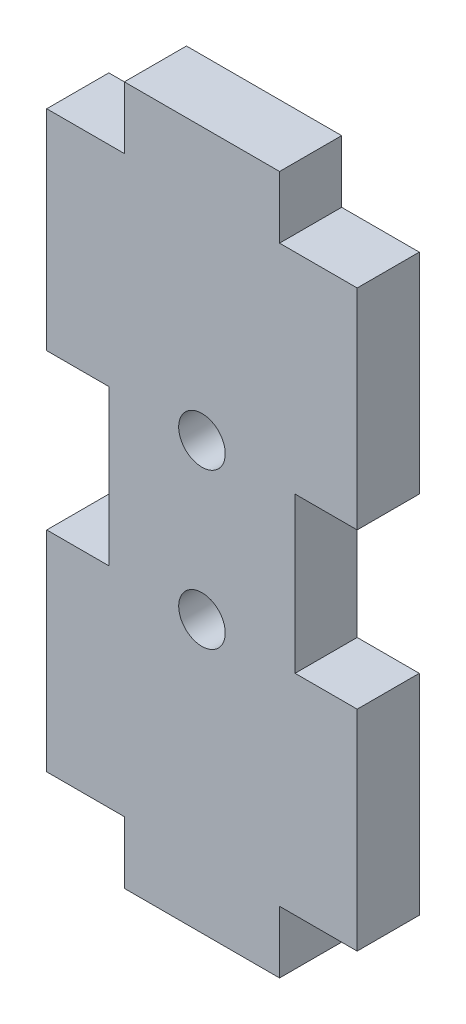
ISO-10303-21;
HEADER;
FILE_DESCRIPTION(('STEP AP214'),'2;1');
FILE_NAME('part.step','',(''),(''),'','','');
FILE_SCHEMA(('AUTOMOTIVE_DESIGN { 1 0 10303 214 1 1 1 1 }'));
ENDSEC;
DATA;
#1=APPLICATION_CONTEXT('core data for automotive mechanical design processes');
#2=APPLICATION_PROTOCOL_DEFINITION('international standard','automotive_design',2000,#1);
#3=PRODUCT_CONTEXT('',#1,'mechanical');
#4=PRODUCT('Part','Part','',(#3));
#5=PRODUCT_RELATED_PRODUCT_CATEGORY('part','',(#4));
#6=PRODUCT_DEFINITION_FORMATION('','',#4);
#7=PRODUCT_DEFINITION_CONTEXT('part definition',#1,'design');
#8=PRODUCT_DEFINITION('design','',#6,#7);
#9=PRODUCT_DEFINITION_SHAPE('','',#8);
#10=(LENGTH_UNIT() NAMED_UNIT(*) SI_UNIT(.MILLI.,.METRE.));
#11=(NAMED_UNIT(*) PLANE_ANGLE_UNIT() SI_UNIT($,.RADIAN.));
#12=(NAMED_UNIT(*) SI_UNIT($,.STERADIAN.) SOLID_ANGLE_UNIT());
#13=UNCERTAINTY_MEASURE_WITH_UNIT(LENGTH_MEASURE(1.E-05),#10,'distance_accuracy_value','');
#14=(GEOMETRIC_REPRESENTATION_CONTEXT(3) GLOBAL_UNCERTAINTY_ASSIGNED_CONTEXT((#13)) GLOBAL_UNIT_ASSIGNED_CONTEXT((#10,
#11,#12)) REPRESENTATION_CONTEXT('',''));
#15=CARTESIAN_POINT('',(0.,0.,0.));
#16=DIRECTION('',(0.,0.,1.));
#17=DIRECTION('',(1.,0.,0.));
#18=AXIS2_PLACEMENT_3D('',#15,#16,#17);
#19=CARTESIAN_POINT('',(0.,0.,4.));
#20=DIRECTION('',(0.,0.,-1.));
#21=DIRECTION('',(-1.,0.,0.));
#22=AXIS2_PLACEMENT_3D('',#19,#20,#21);
#23=PLANE('',#22);
#24=DIRECTION('',(0.,-1.,0.));
#25=VECTOR('',#24,1.);
#26=CARTESIAN_POINT('',(0.,0.,4.));
#27=LINE('',#26,#25);
#28=CARTESIAN_POINT('',(0.,13.5,4.));
#29=VERTEX_POINT('',#28);
#30=CARTESIAN_POINT('',(0.,0.,4.));
#31=VERTEX_POINT('',#30);
#32=EDGE_CURVE('E272',#29,#31,#27,.T.);
#33=ORIENTED_EDGE('',*,*,#32,.T.);
#34=DIRECTION('',(1.,0.,0.));
#35=VECTOR('',#34,1.);
#36=CARTESIAN_POINT('',(0.,0.,4.));
#37=LINE('',#36,#35);
#38=CARTESIAN_POINT('',(5.,0.,4.));
#39=VERTEX_POINT('',#38);
#40=EDGE_CURVE('E136',#31,#39,#37,.T.);
#41=ORIENTED_EDGE('',*,*,#40,.T.);
#42=DIRECTION('',(0.,-1.,0.));
#43=VECTOR('',#42,1.);
#44=CARTESIAN_POINT('',(5.,0.,4.));
#45=LINE('',#44,#43);
#46=CARTESIAN_POINT('',(5.,-4.00000000000001,4.));
#47=VERTEX_POINT('',#46);
#48=EDGE_CURVE('E341',#39,#47,#45,.T.);
#49=ORIENTED_EDGE('',*,*,#48,.T.);
#50=DIRECTION('',(1.,0.,0.));
#51=VECTOR('',#50,1.);
#52=CARTESIAN_POINT('',(5.,-4.00000000000001,4.));
#53=LINE('',#52,#51);
#54=CARTESIAN_POINT('',(15.,-4.00000000000001,4.));
#55=VERTEX_POINT('',#54);
#56=EDGE_CURVE('E361',#47,#55,#53,.T.);
#57=ORIENTED_EDGE('',*,*,#56,.T.);
#58=DIRECTION('',(0.,1.,0.));
#59=VECTOR('',#58,1.);
#60=CARTESIAN_POINT('',(15.,0.,4.));
#61=LINE('',#60,#59);
#62=CARTESIAN_POINT('',(15.,0.,4.));
#63=VERTEX_POINT('',#62);
#64=EDGE_CURVE('E357',#55,#63,#61,.T.);
#65=ORIENTED_EDGE('',*,*,#64,.T.);
#66=DIRECTION('',(1.,0.,0.));
#67=VECTOR('',#66,1.);
#68=CARTESIAN_POINT('',(15.,0.,4.));
#69=LINE('',#68,#67);
#70=CARTESIAN_POINT('',(20.,0.,4.));
#71=VERTEX_POINT('',#70);
#72=EDGE_CURVE('E360',#63,#71,#69,.T.);
#73=ORIENTED_EDGE('',*,*,#72,.T.);
#74=DIRECTION('',(0.,1.,0.));
#75=VECTOR('',#74,1.);
#76=CARTESIAN_POINT('',(20.,0.,4.));
#77=LINE('',#76,#75);
#78=CARTESIAN_POINT('',(20.,13.5,4.));
#79=VERTEX_POINT('',#78);
#80=EDGE_CURVE('E365',#71,#79,#77,.T.);
#81=ORIENTED_EDGE('',*,*,#80,.T.);
#82=DIRECTION('',(-1.,0.,0.));
#83=VECTOR('',#82,1.);
#84=CARTESIAN_POINT('',(20.,13.5,4.));
#85=LINE('',#84,#83);
#86=CARTESIAN_POINT('',(16.,13.5,4.));
#87=VERTEX_POINT('',#86);
#88=EDGE_CURVE('E372',#79,#87,#85,.T.);
#89=ORIENTED_EDGE('',*,*,#88,.T.);
#90=DIRECTION('',(0.,1.,0.));
#91=VECTOR('',#90,1.);
#92=CARTESIAN_POINT('',(16.,23.5,4.));
#93=LINE('',#92,#91);
#94=CARTESIAN_POINT('',(16.,23.5,4.));
#95=VERTEX_POINT('',#94);
#96=EDGE_CURVE('E375',#87,#95,#93,.T.);
#97=ORIENTED_EDGE('',*,*,#96,.T.);
#98=DIRECTION('',(1.,0.,0.));
#99=VECTOR('',#98,1.);
#100=CARTESIAN_POINT('',(20.,23.5,4.));
#101=LINE('',#100,#99);
#102=CARTESIAN_POINT('',(20.,23.5,4.));
#103=VERTEX_POINT('',#102);
#104=EDGE_CURVE('E378',#95,#103,#101,.T.);
#105=ORIENTED_EDGE('',*,*,#104,.T.);
#106=DIRECTION('',(0.,1.,0.));
#107=VECTOR('',#106,1.);
#108=CARTESIAN_POINT('',(20.,23.5,4.));
#109=LINE('',#108,#107);
#110=CARTESIAN_POINT('',(20.,37.,4.));
#111=VERTEX_POINT('',#110);
#112=EDGE_CURVE('E381',#103,#111,#109,.T.);
#113=ORIENTED_EDGE('',*,*,#112,.T.);
#114=DIRECTION('',(-1.,0.,0.));
#115=VECTOR('',#114,1.);
#116=CARTESIAN_POINT('',(15.,37.,4.));
#117=LINE('',#116,#115);
#118=CARTESIAN_POINT('',(15.,37.,4.));
#119=VERTEX_POINT('',#118);
#120=EDGE_CURVE('E384',#111,#119,#117,.T.);
#121=ORIENTED_EDGE('',*,*,#120,.T.);
#122=DIRECTION('',(0.,1.,0.));
#123=VECTOR('',#122,1.);
#124=CARTESIAN_POINT('',(15.,37.,4.));
#125=LINE('',#124,#123);
#126=CARTESIAN_POINT('',(15.,41.,4.));
#127=VERTEX_POINT('',#126);
#128=EDGE_CURVE('E387',#119,#127,#125,.T.);
#129=ORIENTED_EDGE('',*,*,#128,.T.);
#130=DIRECTION('',(-1.,0.,0.));
#131=VECTOR('',#130,1.);
#132=CARTESIAN_POINT('',(5.,41.,4.));
#133=LINE('',#132,#131);
#134=CARTESIAN_POINT('',(5.,41.,4.));
#135=VERTEX_POINT('',#134);
#136=EDGE_CURVE('E390',#127,#135,#133,.T.);
#137=ORIENTED_EDGE('',*,*,#136,.T.);
#138=DIRECTION('',(0.,-1.,0.));
#139=VECTOR('',#138,1.);
#140=CARTESIAN_POINT('',(5.,37.,4.));
#141=LINE('',#140,#139);
#142=CARTESIAN_POINT('',(5.,37.,4.));
#143=VERTEX_POINT('',#142);
#144=EDGE_CURVE('E393',#135,#143,#141,.T.);
#145=ORIENTED_EDGE('',*,*,#144,.T.);
#146=DIRECTION('',(-1.,0.,0.));
#147=VECTOR('',#146,1.);
#148=CARTESIAN_POINT('',(0.,37.,4.));
#149=LINE('',#148,#147);
#150=CARTESIAN_POINT('',(0.,37.,4.));
#151=VERTEX_POINT('',#150);
#152=EDGE_CURVE('E396',#143,#151,#149,.T.);
#153=ORIENTED_EDGE('',*,*,#152,.T.);
#154=DIRECTION('',(0.,-1.,0.));
#155=VECTOR('',#154,1.);
#156=CARTESIAN_POINT('',(0.,23.5,4.));
#157=LINE('',#156,#155);
#158=CARTESIAN_POINT('',(0.,23.5,4.));
#159=VERTEX_POINT('',#158);
#160=EDGE_CURVE('E191',#151,#159,#157,.T.);
#161=ORIENTED_EDGE('',*,*,#160,.T.);
#162=DIRECTION('',(1.,0.,0.));
#163=VECTOR('',#162,1.);
#164=CARTESIAN_POINT('',(0.,23.5,4.));
#165=LINE('',#164,#163);
#166=CARTESIAN_POINT('',(4.,23.5,4.));
#167=VERTEX_POINT('',#166);
#168=EDGE_CURVE('E185',#159,#167,#165,.T.);
#169=ORIENTED_EDGE('',*,*,#168,.T.);
#170=DIRECTION('',(0.,-1.,0.));
#171=VECTOR('',#170,1.);
#172=CARTESIAN_POINT('',(4.,23.5,4.));
#173=LINE('',#172,#171);
#174=CARTESIAN_POINT('',(4.,13.5,4.));
#175=VERTEX_POINT('',#174);
#176=EDGE_CURVE('E189',#167,#175,#173,.T.);
#177=ORIENTED_EDGE('',*,*,#176,.T.);
#178=DIRECTION('',(-1.,0.,0.));
#179=VECTOR('',#178,1.);
#180=CARTESIAN_POINT('',(0.,13.5,4.));
#181=LINE('',#180,#179);
#182=EDGE_CURVE('E57',#175,#29,#181,.T.);
#183=ORIENTED_EDGE('',*,*,#182,.T.);
#184=EDGE_LOOP('',(#33,#41,#49,#57,#65,#73,#81,#89,#97,#105,#113,#121,#129,#137,#145,#153,#161,
#169,#177,#183));
#185=FACE_BOUND('',#184,.T.);
#186=CARTESIAN_POINT('',(10.,23.5,4.));
#187=DIRECTION('',(0.,0.,1.));
#188=DIRECTION('',(1.,0.,0.));
#189=AXIS2_PLACEMENT_3D('',#186,#187,#188);
#190=CIRCLE('',#189,1.5);
#191=CARTESIAN_POINT('',(11.5,23.5,4.));
#192=VERTEX_POINT('',#191);
#193=EDGE_CURVE('E218',#192,#192,#190,.T.);
#194=ORIENTED_EDGE('',*,*,#193,.F.);
#195=EDGE_LOOP('',(#194));
#196=FACE_BOUND('',#195,.T.);
#197=CARTESIAN_POINT('',(10.,13.5,4.));
#198=DIRECTION('',(0.,0.,1.));
#199=DIRECTION('',(-1.,0.,0.));
#200=AXIS2_PLACEMENT_3D('',#197,#198,#199);
#201=CIRCLE('',#200,1.5);
#202=CARTESIAN_POINT('',(8.5,13.5,4.));
#203=VERTEX_POINT('',#202);
#204=EDGE_CURVE('E439',#203,#203,#201,.T.);
#205=ORIENTED_EDGE('',*,*,#204,.F.);
#206=EDGE_LOOP('',(#205));
#207=FACE_BOUND('',#206,.T.);
#208=ADVANCED_FACE('F39',(#185,#196,#207),#23,.F.);
#209=CARTESIAN_POINT('',(0.,0.,0.));
#210=DIRECTION('',(0.,0.,-1.));
#211=DIRECTION('',(-1.,0.,0.));
#212=AXIS2_PLACEMENT_3D('',#209,#210,#211);
#213=PLANE('',#212);
#214=CARTESIAN_POINT('',(10.,23.5,0.));
#215=DIRECTION('',(0.,0.,1.));
#216=DIRECTION('',(1.,0.,0.));
#217=AXIS2_PLACEMENT_3D('',#214,#215,#216);
#218=CIRCLE('',#217,1.5);
#219=CARTESIAN_POINT('',(11.5,23.5,0.));
#220=VERTEX_POINT('',#219);
#221=EDGE_CURVE('E446',#220,#220,#218,.T.);
#222=ORIENTED_EDGE('',*,*,#221,.T.);
#223=EDGE_LOOP('',(#222));
#224=FACE_BOUND('',#223,.T.);
#225=DIRECTION('',(0.,-1.,0.));
#226=VECTOR('',#225,1.);
#227=CARTESIAN_POINT('',(0.,0.,0.));
#228=LINE('',#227,#226);
#229=CARTESIAN_POINT('',(0.,13.5,0.));
#230=VERTEX_POINT('',#229);
#231=CARTESIAN_POINT('',(0.,0.,0.));
#232=VERTEX_POINT('',#231);
#233=EDGE_CURVE('E213',#230,#232,#228,.T.);
#234=ORIENTED_EDGE('',*,*,#233,.F.);
#235=DIRECTION('',(-1.,0.,0.));
#236=VECTOR('',#235,1.);
#237=CARTESIAN_POINT('',(0.,13.5,0.));
#238=LINE('',#237,#236);
#239=CARTESIAN_POINT('',(4.,13.5,0.));
#240=VERTEX_POINT('',#239);
#241=EDGE_CURVE('E128',#240,#230,#238,.T.);
#242=ORIENTED_EDGE('',*,*,#241,.F.);
#243=DIRECTION('',(0.,-1.,0.));
#244=VECTOR('',#243,1.);
#245=CARTESIAN_POINT('',(4.,23.5,0.));
#246=LINE('',#245,#244);
#247=CARTESIAN_POINT('',(4.,23.5,0.));
#248=VERTEX_POINT('',#247);
#249=EDGE_CURVE('E122',#248,#240,#246,.T.);
#250=ORIENTED_EDGE('',*,*,#249,.F.);
#251=DIRECTION('',(1.,0.,0.));
#252=VECTOR('',#251,1.);
#253=CARTESIAN_POINT('',(0.,23.5,0.));
#254=LINE('',#253,#252);
#255=CARTESIAN_POINT('',(0.,23.5,0.));
#256=VERTEX_POINT('',#255);
#257=EDGE_CURVE('E200',#256,#248,#254,.T.);
#258=ORIENTED_EDGE('',*,*,#257,.F.);
#259=DIRECTION('',(0.,-1.,0.));
#260=VECTOR('',#259,1.);
#261=CARTESIAN_POINT('',(0.,23.5,0.));
#262=LINE('',#261,#260);
#263=CARTESIAN_POINT('',(0.,37.,0.));
#264=VERTEX_POINT('',#263);
#265=EDGE_CURVE('E263',#264,#256,#262,.T.);
#266=ORIENTED_EDGE('',*,*,#265,.F.);
#267=DIRECTION('',(-1.,0.,0.));
#268=VECTOR('',#267,1.);
#269=CARTESIAN_POINT('',(0.,37.,0.));
#270=LINE('',#269,#268);
#271=CARTESIAN_POINT('',(5.,37.,0.));
#272=VERTEX_POINT('',#271);
#273=EDGE_CURVE('E260',#272,#264,#270,.T.);
#274=ORIENTED_EDGE('',*,*,#273,.F.);
#275=DIRECTION('',(0.,-1.,0.));
#276=VECTOR('',#275,1.);
#277=CARTESIAN_POINT('',(5.,37.,0.));
#278=LINE('',#277,#276);
#279=CARTESIAN_POINT('',(5.,41.,0.));
#280=VERTEX_POINT('',#279);
#281=EDGE_CURVE('E257',#280,#272,#278,.T.);
#282=ORIENTED_EDGE('',*,*,#281,.F.);
#283=DIRECTION('',(-1.,0.,0.));
#284=VECTOR('',#283,1.);
#285=CARTESIAN_POINT('',(5.,41.,0.));
#286=LINE('',#285,#284);
#287=CARTESIAN_POINT('',(15.,41.,0.));
#288=VERTEX_POINT('',#287);
#289=EDGE_CURVE('E254',#288,#280,#286,.T.);
#290=ORIENTED_EDGE('',*,*,#289,.F.);
#291=DIRECTION('',(0.,1.,0.));
#292=VECTOR('',#291,1.);
#293=CARTESIAN_POINT('',(15.,37.,0.));
#294=LINE('',#293,#292);
#295=CARTESIAN_POINT('',(15.,37.,0.));
#296=VERTEX_POINT('',#295);
#297=EDGE_CURVE('E251',#296,#288,#294,.T.);
#298=ORIENTED_EDGE('',*,*,#297,.F.);
#299=DIRECTION('',(-1.,0.,0.));
#300=VECTOR('',#299,1.);
#301=CARTESIAN_POINT('',(15.,37.,0.));
#302=LINE('',#301,#300);
#303=CARTESIAN_POINT('',(20.,37.,0.));
#304=VERTEX_POINT('',#303);
#305=EDGE_CURVE('E248',#304,#296,#302,.T.);
#306=ORIENTED_EDGE('',*,*,#305,.F.);
#307=DIRECTION('',(0.,1.,0.));
#308=VECTOR('',#307,1.);
#309=CARTESIAN_POINT('',(20.,23.5,0.));
#310=LINE('',#309,#308);
#311=CARTESIAN_POINT('',(20.,23.5,0.));
#312=VERTEX_POINT('',#311);
#313=EDGE_CURVE('E245',#312,#304,#310,.T.);
#314=ORIENTED_EDGE('',*,*,#313,.F.);
#315=DIRECTION('',(1.,0.,0.));
#316=VECTOR('',#315,1.);
#317=CARTESIAN_POINT('',(20.,23.5,0.));
#318=LINE('',#317,#316);
#319=CARTESIAN_POINT('',(16.,23.5,0.));
#320=VERTEX_POINT('',#319);
#321=EDGE_CURVE('E242',#320,#312,#318,.T.);
#322=ORIENTED_EDGE('',*,*,#321,.F.);
#323=DIRECTION('',(0.,1.,0.));
#324=VECTOR('',#323,1.);
#325=CARTESIAN_POINT('',(16.,23.5,0.));
#326=LINE('',#325,#324);
#327=CARTESIAN_POINT('',(16.,13.5,0.));
#328=VERTEX_POINT('',#327);
#329=EDGE_CURVE('E239',#328,#320,#326,.T.);
#330=ORIENTED_EDGE('',*,*,#329,.F.);
#331=DIRECTION('',(-1.,0.,0.));
#332=VECTOR('',#331,1.);
#333=CARTESIAN_POINT('',(20.,13.5,0.));
#334=LINE('',#333,#332);
#335=CARTESIAN_POINT('',(20.,13.5,0.));
#336=VERTEX_POINT('',#335);
#337=EDGE_CURVE('E236',#336,#328,#334,.T.);
#338=ORIENTED_EDGE('',*,*,#337,.F.);
#339=DIRECTION('',(0.,1.,0.));
#340=VECTOR('',#339,1.);
#341=CARTESIAN_POINT('',(20.,0.,0.));
#342=LINE('',#341,#340);
#343=CARTESIAN_POINT('',(20.,0.,0.));
#344=VERTEX_POINT('',#343);
#345=EDGE_CURVE('E233',#344,#336,#342,.T.);
#346=ORIENTED_EDGE('',*,*,#345,.F.);
#347=DIRECTION('',(1.,0.,0.));
#348=VECTOR('',#347,1.);
#349=CARTESIAN_POINT('',(15.,0.,0.));
#350=LINE('',#349,#348);
#351=CARTESIAN_POINT('',(15.,0.,0.));
#352=VERTEX_POINT('',#351);
#353=EDGE_CURVE('E230',#352,#344,#350,.T.);
#354=ORIENTED_EDGE('',*,*,#353,.F.);
#355=DIRECTION('',(0.,1.,0.));
#356=VECTOR('',#355,1.);
#357=CARTESIAN_POINT('',(15.,0.,0.));
#358=LINE('',#357,#356);
#359=CARTESIAN_POINT('',(15.,-4.00000000000001,0.));
#360=VERTEX_POINT('',#359);
#361=EDGE_CURVE('E227',#360,#352,#358,.T.);
#362=ORIENTED_EDGE('',*,*,#361,.F.);
#363=DIRECTION('',(1.,0.,0.));
#364=VECTOR('',#363,1.);
#365=CARTESIAN_POINT('',(5.,-4.00000000000001,0.));
#366=LINE('',#365,#364);
#367=CARTESIAN_POINT('',(5.,-4.00000000000001,0.));
#368=VERTEX_POINT('',#367);
#369=EDGE_CURVE('E224',#368,#360,#366,.T.);
#370=ORIENTED_EDGE('',*,*,#369,.F.);
#371=DIRECTION('',(0.,-1.,0.));
#372=VECTOR('',#371,1.);
#373=CARTESIAN_POINT('',(5.,0.,0.));
#374=LINE('',#373,#372);
#375=CARTESIAN_POINT('',(5.,0.,0.));
#376=VERTEX_POINT('',#375);
#377=EDGE_CURVE('E221',#376,#368,#374,.T.);
#378=ORIENTED_EDGE('',*,*,#377,.F.);
#379=DIRECTION('',(1.,0.,0.));
#380=VECTOR('',#379,1.);
#381=CARTESIAN_POINT('',(0.,0.,0.));
#382=LINE('',#381,#380);
#383=EDGE_CURVE('E217',#232,#376,#382,.T.);
#384=ORIENTED_EDGE('',*,*,#383,.F.);
#385=EDGE_LOOP('',(#234,#242,#250,#258,#266,#274,#282,#290,#298,#306,#314,#322,#330,#338,#346,
#354,#362,#370,#378,#384));
#386=FACE_BOUND('',#385,.T.);
#387=CARTESIAN_POINT('',(10.,13.5,0.));
#388=DIRECTION('',(0.,0.,1.));
#389=DIRECTION('',(-1.,0.,0.));
#390=AXIS2_PLACEMENT_3D('',#387,#388,#389);
#391=CIRCLE('',#390,1.5);
#392=CARTESIAN_POINT('',(8.5,13.5,0.));
#393=VERTEX_POINT('',#392);
#394=EDGE_CURVE('E442',#393,#393,#391,.T.);
#395=ORIENTED_EDGE('',*,*,#394,.T.);
#396=EDGE_LOOP('',(#395));
#397=FACE_BOUND('',#396,.T.);
#398=ADVANCED_FACE('F345',(#224,#386,#397),#213,.T.);
#399=CARTESIAN_POINT('',(0.,0.,4.));
#400=DIRECTION('',(1.,0.,0.));
#401=DIRECTION('',(0.,0.,-1.));
#402=AXIS2_PLACEMENT_3D('',#399,#400,#401);
#403=PLANE('',#402);
#404=ORIENTED_EDGE('',*,*,#233,.T.);
#405=DIRECTION('',(0.,0.,-1.));
#406=VECTOR('',#405,1.);
#407=CARTESIAN_POINT('',(0.,0.,4.));
#408=LINE('',#407,#406);
#409=EDGE_CURVE('E11',#31,#232,#408,.T.);
#410=ORIENTED_EDGE('',*,*,#409,.F.);
#411=ORIENTED_EDGE('',*,*,#32,.F.);
#412=DIRECTION('',(0.,0.,-1.));
#413=VECTOR('',#412,1.);
#414=CARTESIAN_POINT('',(0.,13.5,4.));
#415=LINE('',#414,#413);
#416=EDGE_CURVE('E209',#29,#230,#415,.T.);
#417=ORIENTED_EDGE('',*,*,#416,.T.);
#418=EDGE_LOOP('',(#404,#410,#411,#417));
#419=FACE_BOUND('',#418,.T.);
#420=ADVANCED_FACE('F41',(#419),#403,.F.);
#421=CARTESIAN_POINT('',(0.,0.,4.));
#422=DIRECTION('',(0.,1.,0.));
#423=DIRECTION('',(-1.,0.,0.));
#424=AXIS2_PLACEMENT_3D('',#421,#422,#423);
#425=PLANE('',#424);
#426=ORIENTED_EDGE('',*,*,#383,.T.);
#427=DIRECTION('',(0.,0.,-1.));
#428=VECTOR('',#427,1.);
#429=CARTESIAN_POINT('',(5.,0.,4.));
#430=LINE('',#429,#428);
#431=EDGE_CURVE('E49',#39,#376,#430,.T.);
#432=ORIENTED_EDGE('',*,*,#431,.F.);
#433=ORIENTED_EDGE('',*,*,#40,.F.);
#434=ORIENTED_EDGE('',*,*,#409,.T.);
#435=EDGE_LOOP('',(#426,#432,#433,#434));
#436=FACE_BOUND('',#435,.T.);
#437=ADVANCED_FACE('F626',(#436),#425,.F.);
#438=CARTESIAN_POINT('',(5.,0.,4.));
#439=DIRECTION('',(1.,0.,0.));
#440=DIRECTION('',(0.,0.,-1.));
#441=AXIS2_PLACEMENT_3D('',#438,#439,#440);
#442=PLANE('',#441);
#443=ORIENTED_EDGE('',*,*,#377,.T.);
#444=DIRECTION('',(0.,0.,-1.));
#445=VECTOR('',#444,1.);
#446=CARTESIAN_POINT('',(5.,-4.00000000000001,4.));
#447=LINE('',#446,#445);
#448=EDGE_CURVE('E331',#47,#368,#447,.T.);
#449=ORIENTED_EDGE('',*,*,#448,.F.);
#450=ORIENTED_EDGE('',*,*,#48,.F.);
#451=ORIENTED_EDGE('',*,*,#431,.T.);
#452=EDGE_LOOP('',(#443,#449,#450,#451));
#453=FACE_BOUND('',#452,.T.);
#454=ADVANCED_FACE('F339',(#453),#442,.F.);
#455=CARTESIAN_POINT('',(5.,-4.00000000000001,4.));
#456=DIRECTION('',(0.,1.,0.));
#457=DIRECTION('',(0.,0.,1.));
#458=AXIS2_PLACEMENT_3D('',#455,#456,#457);
#459=PLANE('',#458);
#460=ORIENTED_EDGE('',*,*,#369,.T.);
#461=DIRECTION('',(0.,0.,-1.));
#462=VECTOR('',#461,1.);
#463=CARTESIAN_POINT('',(15.,-4.00000000000001,4.));
#464=LINE('',#463,#462);
#465=EDGE_CURVE('E327',#55,#360,#464,.T.);
#466=ORIENTED_EDGE('',*,*,#465,.F.);
#467=ORIENTED_EDGE('',*,*,#56,.F.);
#468=ORIENTED_EDGE('',*,*,#448,.T.);
#469=EDGE_LOOP('',(#460,#466,#467,#468));
#470=FACE_BOUND('',#469,.T.);
#471=ADVANCED_FACE('F351',(#470),#459,.F.);
#472=CARTESIAN_POINT('',(15.,0.,4.));
#473=DIRECTION('',(-1.,0.,0.));
#474=DIRECTION('',(0.,-1.,0.));
#475=AXIS2_PLACEMENT_3D('',#472,#473,#474);
#476=PLANE('',#475);
#477=ORIENTED_EDGE('',*,*,#361,.T.);
#478=DIRECTION('',(0.,0.,-1.));
#479=VECTOR('',#478,1.);
#480=CARTESIAN_POINT('',(15.,0.,4.));
#481=LINE('',#480,#479);
#482=EDGE_CURVE('E323',#63,#352,#481,.T.);
#483=ORIENTED_EDGE('',*,*,#482,.F.);
#484=ORIENTED_EDGE('',*,*,#64,.F.);
#485=ORIENTED_EDGE('',*,*,#465,.T.);
#486=EDGE_LOOP('',(#477,#483,#484,#485));
#487=FACE_BOUND('',#486,.T.);
#488=ADVANCED_FACE('F355',(#487),#476,.F.);
#489=CARTESIAN_POINT('',(15.,0.,4.));
#490=DIRECTION('',(0.,1.,0.));
#491=DIRECTION('',(-1.,0.,0.));
#492=AXIS2_PLACEMENT_3D('',#489,#490,#491);
#493=PLANE('',#492);
#494=ORIENTED_EDGE('',*,*,#353,.T.);
#495=DIRECTION('',(0.,0.,-1.));
#496=VECTOR('',#495,1.);
#497=CARTESIAN_POINT('',(20.,0.,4.));
#498=LINE('',#497,#496);
#499=EDGE_CURVE('E319',#71,#344,#498,.T.);
#500=ORIENTED_EDGE('',*,*,#499,.F.);
#501=ORIENTED_EDGE('',*,*,#72,.F.);
#502=ORIENTED_EDGE('',*,*,#482,.T.);
#503=EDGE_LOOP('',(#494,#500,#501,#502));
#504=FACE_BOUND('',#503,.T.);
#505=ADVANCED_FACE('F591',(#504),#493,.F.);
#506=CARTESIAN_POINT('',(20.,0.,4.));
#507=DIRECTION('',(-1.,0.,0.));
#508=DIRECTION('',(0.,-1.,0.));
#509=AXIS2_PLACEMENT_3D('',#506,#507,#508);
#510=PLANE('',#509);
#511=ORIENTED_EDGE('',*,*,#345,.T.);
#512=DIRECTION('',(0.,0.,-1.));
#513=VECTOR('',#512,1.);
#514=CARTESIAN_POINT('',(20.,13.5,4.));
#515=LINE('',#514,#513);
#516=EDGE_CURVE('E315',#79,#336,#515,.T.);
#517=ORIENTED_EDGE('',*,*,#516,.F.);
#518=ORIENTED_EDGE('',*,*,#80,.F.);
#519=ORIENTED_EDGE('',*,*,#499,.T.);
#520=EDGE_LOOP('',(#511,#517,#518,#519));
#521=FACE_BOUND('',#520,.T.);
#522=ADVANCED_FACE('F581',(#521),#510,.F.);
#523=CARTESIAN_POINT('',(20.,13.5,4.));
#524=DIRECTION('',(0.,-1.,0.));
#525=DIRECTION('',(0.,0.,-1.));
#526=AXIS2_PLACEMENT_3D('',#523,#524,#525);
#527=PLANE('',#526);
#528=ORIENTED_EDGE('',*,*,#337,.T.);
#529=DIRECTION('',(0.,0.,-1.));
#530=VECTOR('',#529,1.);
#531=CARTESIAN_POINT('',(16.,13.5,4.));
#532=LINE('',#531,#530);
#533=EDGE_CURVE('E311',#87,#328,#532,.T.);
#534=ORIENTED_EDGE('',*,*,#533,.F.);
#535=ORIENTED_EDGE('',*,*,#88,.F.);
#536=ORIENTED_EDGE('',*,*,#516,.T.);
#537=EDGE_LOOP('',(#528,#534,#535,#536));
#538=FACE_BOUND('',#537,.T.);
#539=ADVANCED_FACE('F571',(#538),#527,.F.);
#540=CARTESIAN_POINT('',(16.,23.5,4.));
#541=DIRECTION('',(-1.,0.,0.));
#542=DIRECTION('',(0.,0.,1.));
#543=AXIS2_PLACEMENT_3D('',#540,#541,#542);
#544=PLANE('',#543);
#545=ORIENTED_EDGE('',*,*,#329,.T.);
#546=DIRECTION('',(0.,0.,-1.));
#547=VECTOR('',#546,1.);
#548=CARTESIAN_POINT('',(16.,23.5,4.));
#549=LINE('',#548,#547);
#550=EDGE_CURVE('E307',#95,#320,#549,.T.);
#551=ORIENTED_EDGE('',*,*,#550,.F.);
#552=ORIENTED_EDGE('',*,*,#96,.F.);
#553=ORIENTED_EDGE('',*,*,#533,.T.);
#554=EDGE_LOOP('',(#545,#551,#552,#553));
#555=FACE_BOUND('',#554,.T.);
#556=ADVANCED_FACE('F561',(#555),#544,.F.);
#557=CARTESIAN_POINT('',(20.,23.5,4.));
#558=DIRECTION('',(0.,1.,0.));
#559=DIRECTION('',(0.,0.,1.));
#560=AXIS2_PLACEMENT_3D('',#557,#558,#559);
#561=PLANE('',#560);
#562=ORIENTED_EDGE('',*,*,#321,.T.);
#563=DIRECTION('',(0.,0.,-1.));
#564=VECTOR('',#563,1.);
#565=CARTESIAN_POINT('',(20.,23.5,4.));
#566=LINE('',#565,#564);
#567=EDGE_CURVE('E303',#103,#312,#566,.T.);
#568=ORIENTED_EDGE('',*,*,#567,.F.);
#569=ORIENTED_EDGE('',*,*,#104,.F.);
#570=ORIENTED_EDGE('',*,*,#550,.T.);
#571=EDGE_LOOP('',(#562,#568,#569,#570));
#572=FACE_BOUND('',#571,.T.);
#573=ADVANCED_FACE('F551',(#572),#561,.F.);
#574=CARTESIAN_POINT('',(20.,23.5,4.));
#575=DIRECTION('',(-1.,0.,0.));
#576=DIRECTION('',(0.,-1.,0.));
#577=AXIS2_PLACEMENT_3D('',#574,#575,#576);
#578=PLANE('',#577);
#579=ORIENTED_EDGE('',*,*,#313,.T.);
#580=DIRECTION('',(0.,0.,-1.));
#581=VECTOR('',#580,1.);
#582=CARTESIAN_POINT('',(20.,37.,4.));
#583=LINE('',#582,#581);
#584=EDGE_CURVE('E299',#111,#304,#583,.T.);
#585=ORIENTED_EDGE('',*,*,#584,.F.);
#586=ORIENTED_EDGE('',*,*,#112,.F.);
#587=ORIENTED_EDGE('',*,*,#567,.T.);
#588=EDGE_LOOP('',(#579,#585,#586,#587));
#589=FACE_BOUND('',#588,.T.);
#590=ADVANCED_FACE('F541',(#589),#578,.F.);
#591=CARTESIAN_POINT('',(15.,37.,4.));
#592=DIRECTION('',(0.,-1.,0.));
#593=DIRECTION('',(1.,0.,0.));
#594=AXIS2_PLACEMENT_3D('',#591,#592,#593);
#595=PLANE('',#594);
#596=ORIENTED_EDGE('',*,*,#305,.T.);
#597=DIRECTION('',(0.,0.,-1.));
#598=VECTOR('',#597,1.);
#599=CARTESIAN_POINT('',(15.,37.,4.));
#600=LINE('',#599,#598);
#601=EDGE_CURVE('E295',#119,#296,#600,.T.);
#602=ORIENTED_EDGE('',*,*,#601,.F.);
#603=ORIENTED_EDGE('',*,*,#120,.F.);
#604=ORIENTED_EDGE('',*,*,#584,.T.);
#605=EDGE_LOOP('',(#596,#602,#603,#604));
#606=FACE_BOUND('',#605,.T.);
#607=ADVANCED_FACE('F531',(#606),#595,.F.);
#608=CARTESIAN_POINT('',(15.,37.,4.));
#609=DIRECTION('',(-1.,0.,0.));
#610=DIRECTION('',(0.,0.,1.));
#611=AXIS2_PLACEMENT_3D('',#608,#609,#610);
#612=PLANE('',#611);
#613=ORIENTED_EDGE('',*,*,#297,.T.);
#614=DIRECTION('',(0.,0.,-1.));
#615=VECTOR('',#614,1.);
#616=CARTESIAN_POINT('',(15.,41.,4.));
#617=LINE('',#616,#615);
#618=EDGE_CURVE('E291',#127,#288,#617,.T.);
#619=ORIENTED_EDGE('',*,*,#618,.F.);
#620=ORIENTED_EDGE('',*,*,#128,.F.);
#621=ORIENTED_EDGE('',*,*,#601,.T.);
#622=EDGE_LOOP('',(#613,#619,#620,#621));
#623=FACE_BOUND('',#622,.T.);
#624=ADVANCED_FACE('F521',(#623),#612,.F.);
#625=CARTESIAN_POINT('',(5.,41.,4.));
#626=DIRECTION('',(0.,-1.,0.));
#627=DIRECTION('',(0.,0.,-1.));
#628=AXIS2_PLACEMENT_3D('',#625,#626,#627);
#629=PLANE('',#628);
#630=ORIENTED_EDGE('',*,*,#289,.T.);
#631=DIRECTION('',(0.,0.,-1.));
#632=VECTOR('',#631,1.);
#633=CARTESIAN_POINT('',(5.,41.,4.));
#634=LINE('',#633,#632);
#635=EDGE_CURVE('E287',#135,#280,#634,.T.);
#636=ORIENTED_EDGE('',*,*,#635,.F.);
#637=ORIENTED_EDGE('',*,*,#136,.F.);
#638=ORIENTED_EDGE('',*,*,#618,.T.);
#639=EDGE_LOOP('',(#630,#636,#637,#638));
#640=FACE_BOUND('',#639,.T.);
#641=ADVANCED_FACE('F511',(#640),#629,.F.);
#642=CARTESIAN_POINT('',(5.,37.,4.));
#643=DIRECTION('',(1.,0.,0.));
#644=DIRECTION('',(0.,1.,0.));
#645=AXIS2_PLACEMENT_3D('',#642,#643,#644);
#646=PLANE('',#645);
#647=ORIENTED_EDGE('',*,*,#281,.T.);
#648=DIRECTION('',(0.,0.,-1.));
#649=VECTOR('',#648,1.);
#650=CARTESIAN_POINT('',(5.,37.,4.));
#651=LINE('',#650,#649);
#652=EDGE_CURVE('E283',#143,#272,#651,.T.);
#653=ORIENTED_EDGE('',*,*,#652,.F.);
#654=ORIENTED_EDGE('',*,*,#144,.F.);
#655=ORIENTED_EDGE('',*,*,#635,.T.);
#656=EDGE_LOOP('',(#647,#653,#654,#655));
#657=FACE_BOUND('',#656,.T.);
#658=ADVANCED_FACE('F502',(#657),#646,.F.);
#659=CARTESIAN_POINT('',(0.,37.,4.));
#660=DIRECTION('',(0.,-1.,0.));
#661=DIRECTION('',(1.,0.,0.));
#662=AXIS2_PLACEMENT_3D('',#659,#660,#661);
#663=PLANE('',#662);
#664=ORIENTED_EDGE('',*,*,#273,.T.);
#665=DIRECTION('',(0.,0.,-1.));
#666=VECTOR('',#665,1.);
#667=CARTESIAN_POINT('',(0.,37.,4.));
#668=LINE('',#667,#666);
#669=EDGE_CURVE('E279',#151,#264,#668,.T.);
#670=ORIENTED_EDGE('',*,*,#669,.F.);
#671=ORIENTED_EDGE('',*,*,#152,.F.);
#672=ORIENTED_EDGE('',*,*,#652,.T.);
#673=EDGE_LOOP('',(#664,#670,#671,#672));
#674=FACE_BOUND('',#673,.T.);
#675=ADVANCED_FACE('F404',(#674),#663,.F.);
#676=CARTESIAN_POINT('',(0.,23.5,4.));
#677=DIRECTION('',(1.,0.,0.));
#678=DIRECTION('',(0.,0.,-1.));
#679=AXIS2_PLACEMENT_3D('',#676,#677,#678);
#680=PLANE('',#679);
#681=ORIENTED_EDGE('',*,*,#265,.T.);
#682=DIRECTION('',(0.,0.,-1.));
#683=VECTOR('',#682,1.);
#684=CARTESIAN_POINT('',(0.,23.5,4.));
#685=LINE('',#684,#683);
#686=EDGE_CURVE('E202',#159,#256,#685,.T.);
#687=ORIENTED_EDGE('',*,*,#686,.F.);
#688=ORIENTED_EDGE('',*,*,#160,.F.);
#689=ORIENTED_EDGE('',*,*,#669,.T.);
#690=EDGE_LOOP('',(#681,#687,#688,#689));
#691=FACE_BOUND('',#690,.T.);
#692=ADVANCED_FACE('F408',(#691),#680,.F.);
#693=CARTESIAN_POINT('',(0.,23.5,4.));
#694=DIRECTION('',(0.,1.,0.));
#695=DIRECTION('',(0.,0.,1.));
#696=AXIS2_PLACEMENT_3D('',#693,#694,#695);
#697=PLANE('',#696);
#698=ORIENTED_EDGE('',*,*,#257,.T.);
#699=DIRECTION('',(0.,0.,-1.));
#700=VECTOR('',#699,1.);
#701=CARTESIAN_POINT('',(4.,23.5,4.));
#702=LINE('',#701,#700);
#703=EDGE_CURVE('E197',#167,#248,#702,.T.);
#704=ORIENTED_EDGE('',*,*,#703,.F.);
#705=ORIENTED_EDGE('',*,*,#168,.F.);
#706=ORIENTED_EDGE('',*,*,#686,.T.);
#707=EDGE_LOOP('',(#698,#704,#705,#706));
#708=FACE_BOUND('',#707,.T.);
#709=ADVANCED_FACE('F198',(#708),#697,.F.);
#710=CARTESIAN_POINT('',(4.,23.5,4.));
#711=DIRECTION('',(1.,0.,0.));
#712=DIRECTION('',(0.,0.,-1.));
#713=AXIS2_PLACEMENT_3D('',#710,#711,#712);
#714=PLANE('',#713);
#715=ORIENTED_EDGE('',*,*,#249,.T.);
#716=DIRECTION('',(0.,0.,-1.));
#717=VECTOR('',#716,1.);
#718=CARTESIAN_POINT('',(4.,13.5,4.));
#719=LINE('',#718,#717);
#720=EDGE_CURVE('E203',#175,#240,#719,.T.);
#721=ORIENTED_EDGE('',*,*,#720,.F.);
#722=ORIENTED_EDGE('',*,*,#176,.F.);
#723=ORIENTED_EDGE('',*,*,#703,.T.);
#724=EDGE_LOOP('',(#715,#721,#722,#723));
#725=FACE_BOUND('',#724,.T.);
#726=ADVANCED_FACE('F205',(#725),#714,.F.);
#727=CARTESIAN_POINT('',(0.,13.5,4.));
#728=DIRECTION('',(0.,-1.,0.));
#729=DIRECTION('',(0.,0.,-1.));
#730=AXIS2_PLACEMENT_3D('',#727,#728,#729);
#731=PLANE('',#730);
#732=ORIENTED_EDGE('',*,*,#241,.T.);
#733=ORIENTED_EDGE('',*,*,#416,.F.);
#734=ORIENTED_EDGE('',*,*,#182,.F.);
#735=ORIENTED_EDGE('',*,*,#720,.T.);
#736=EDGE_LOOP('',(#732,#733,#734,#735));
#737=FACE_BOUND('',#736,.T.);
#738=ADVANCED_FACE('F412',(#737),#731,.F.);
#739=CARTESIAN_POINT('',(10.,23.5,4.));
#740=DIRECTION('',(0.,0.,-1.));
#741=DIRECTION('',(-1.,0.,0.));
#742=AXIS2_PLACEMENT_3D('',#739,#740,#741);
#743=CYLINDRICAL_SURFACE('',#742,1.5);
#744=ORIENTED_EDGE('',*,*,#193,.T.);
#745=EDGE_LOOP('',(#744));
#746=FACE_BOUND('',#745,.T.);
#747=ORIENTED_EDGE('',*,*,#221,.F.);
#748=EDGE_LOOP('',(#747));
#749=FACE_BOUND('',#748,.T.);
#750=ADVANCED_FACE('F414',(#746,#749),#743,.F.);
#751=CARTESIAN_POINT('',(10.,13.5,4.));
#752=DIRECTION('',(0.,0.,-1.));
#753=DIRECTION('',(-1.,0.,0.));
#754=AXIS2_PLACEMENT_3D('',#751,#752,#753);
#755=CYLINDRICAL_SURFACE('',#754,1.5);
#756=ORIENTED_EDGE('',*,*,#204,.T.);
#757=EDGE_LOOP('',(#756));
#758=FACE_BOUND('',#757,.T.);
#759=ORIENTED_EDGE('',*,*,#394,.F.);
#760=EDGE_LOOP('',(#759));
#761=FACE_BOUND('',#760,.T.);
#762=ADVANCED_FACE('F420',(#758,#761),#755,.F.);
#763=CLOSED_SHELL('',(#208,#398,#420,#437,#454,#471,#488,#505,#522,#539,#556,#573,#590,#607,
#624,#641,#658,#675,#692,#709,#726,#738,#750,#762));
#764=MANIFOLD_SOLID_BREP('B2',#763);
#765=ADVANCED_BREP_SHAPE_REPRESENTATION('',(#18,#764),#14);
#766=SHAPE_DEFINITION_REPRESENTATION(#9,#765);
ENDSEC;
END-ISO-10303-21;
